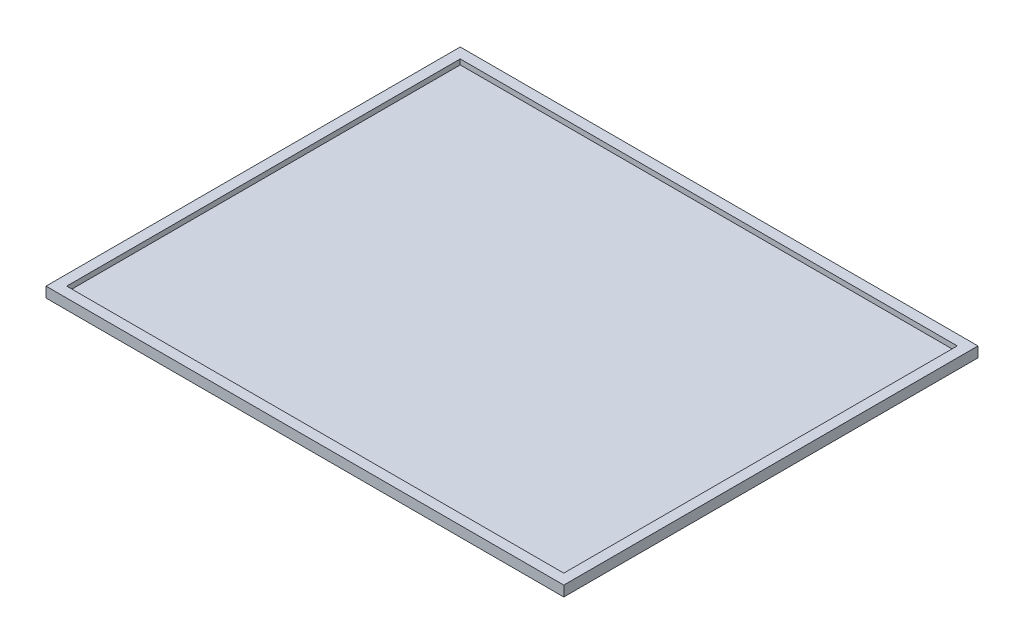
ISO-10303-21;
HEADER;
FILE_DESCRIPTION(('STEP AP214'),'2;1');
FILE_NAME('part.step','',(''),(''),'','','');
FILE_SCHEMA(('AUTOMOTIVE_DESIGN { 1 0 10303 214 1 1 1 1 }'));
ENDSEC;
DATA;
#1=APPLICATION_CONTEXT('core data for automotive mechanical design processes');
#2=APPLICATION_PROTOCOL_DEFINITION('international standard','automotive_design',2000,#1);
#3=PRODUCT_CONTEXT('',#1,'mechanical');
#4=PRODUCT('Part','Part','',(#3));
#5=PRODUCT_RELATED_PRODUCT_CATEGORY('part','',(#4));
#6=PRODUCT_DEFINITION_FORMATION('','',#4);
#7=PRODUCT_DEFINITION_CONTEXT('part definition',#1,'design');
#8=PRODUCT_DEFINITION('design','',#6,#7);
#9=PRODUCT_DEFINITION_SHAPE('','',#8);
#10=(LENGTH_UNIT() NAMED_UNIT(*) SI_UNIT(.MILLI.,.METRE.));
#11=(NAMED_UNIT(*) PLANE_ANGLE_UNIT() SI_UNIT($,.RADIAN.));
#12=(NAMED_UNIT(*) SI_UNIT($,.STERADIAN.) SOLID_ANGLE_UNIT());
#13=UNCERTAINTY_MEASURE_WITH_UNIT(LENGTH_MEASURE(1.E-05),#10,'distance_accuracy_value','');
#14=(GEOMETRIC_REPRESENTATION_CONTEXT(3) GLOBAL_UNCERTAINTY_ASSIGNED_CONTEXT((#13)) GLOBAL_UNIT_ASSIGNED_CONTEXT((#10,
#11,#12)) REPRESENTATION_CONTEXT('',''));
#15=CARTESIAN_POINT('',(0.,0.,0.));
#16=DIRECTION('',(0.,0.,1.));
#17=DIRECTION('',(1.,0.,0.));
#18=AXIS2_PLACEMENT_3D('',#15,#16,#17);
#19=CARTESIAN_POINT('',(0.,10.,0.));
#20=DIRECTION('',(0.,-1.,0.));
#21=DIRECTION('',(0.,0.,-1.));
#22=AXIS2_PLACEMENT_3D('',#19,#20,#21);
#23=PLANE('',#22);
#24=DIRECTION('',(0.,0.,-1.));
#25=VECTOR('',#24,1.);
#26=CARTESIAN_POINT('',(250.,10.,200.));
#27=LINE('',#26,#25);
#28=CARTESIAN_POINT('',(250.,10.,200.));
#29=VERTEX_POINT('',#28);
#30=CARTESIAN_POINT('',(250.,10.,-200.));
#31=VERTEX_POINT('',#30);
#32=EDGE_CURVE('E137',#29,#31,#27,.T.);
#33=ORIENTED_EDGE('',*,*,#32,.T.);
#34=DIRECTION('',(-1.,0.,0.));
#35=VECTOR('',#34,1.);
#36=CARTESIAN_POINT('',(-250.,10.,-200.));
#37=LINE('',#36,#35);
#38=CARTESIAN_POINT('',(-250.,10.,-200.));
#39=VERTEX_POINT('',#38);
#40=EDGE_CURVE('E140',#31,#39,#37,.T.);
#41=ORIENTED_EDGE('',*,*,#40,.T.);
#42=DIRECTION('',(0.,0.,1.));
#43=VECTOR('',#42,1.);
#44=CARTESIAN_POINT('',(-250.,10.,200.));
#45=LINE('',#44,#43);
#46=CARTESIAN_POINT('',(-250.,10.,200.));
#47=VERTEX_POINT('',#46);
#48=EDGE_CURVE('E143',#39,#47,#45,.T.);
#49=ORIENTED_EDGE('',*,*,#48,.T.);
#50=DIRECTION('',(1.,0.,0.));
#51=VECTOR('',#50,1.);
#52=CARTESIAN_POINT('',(-250.,10.,200.));
#53=LINE('',#52,#51);
#54=EDGE_CURVE('E145',#47,#29,#53,.T.);
#55=ORIENTED_EDGE('',*,*,#54,.T.);
#56=EDGE_LOOP('',(#33,#41,#49,#55));
#57=FACE_BOUND('',#56,.T.);
#58=DIRECTION('',(1.,0.,0.));
#59=VECTOR('',#58,1.);
#60=CARTESIAN_POINT('',(-240.,10.,190.));
#61=LINE('',#60,#59);
#62=CARTESIAN_POINT('',(-240.,10.,190.));
#63=VERTEX_POINT('',#62);
#64=CARTESIAN_POINT('',(240.,10.,190.));
#65=VERTEX_POINT('',#64);
#66=EDGE_CURVE('E124',#63,#65,#61,.T.);
#67=ORIENTED_EDGE('',*,*,#66,.F.);
#68=DIRECTION('',(0.,0.,1.));
#69=VECTOR('',#68,1.);
#70=CARTESIAN_POINT('',(-240.,10.,190.));
#71=LINE('',#70,#69);
#72=CARTESIAN_POINT('',(-240.,10.,-190.));
#73=VERTEX_POINT('',#72);
#74=EDGE_CURVE('E108',#73,#63,#71,.T.);
#75=ORIENTED_EDGE('',*,*,#74,.F.);
#76=DIRECTION('',(-1.,0.,0.));
#77=VECTOR('',#76,1.);
#78=CARTESIAN_POINT('',(-240.,10.,-190.));
#79=LINE('',#78,#77);
#80=CARTESIAN_POINT('',(240.,10.,-190.));
#81=VERTEX_POINT('',#80);
#82=EDGE_CURVE('E128',#81,#73,#79,.T.);
#83=ORIENTED_EDGE('',*,*,#82,.F.);
#84=DIRECTION('',(0.,0.,-1.));
#85=VECTOR('',#84,1.);
#86=CARTESIAN_POINT('',(240.,10.,190.));
#87=LINE('',#86,#85);
#88=EDGE_CURVE('E126',#65,#81,#87,.T.);
#89=ORIENTED_EDGE('',*,*,#88,.F.);
#90=EDGE_LOOP('',(#67,#75,#83,#89));
#91=FACE_BOUND('',#90,.T.);
#92=ADVANCED_FACE('F35',(#57,#91),#23,.F.);
#93=CARTESIAN_POINT('',(0.,0.,0.));
#94=DIRECTION('',(0.,-1.,0.));
#95=DIRECTION('',(0.,0.,-1.));
#96=AXIS2_PLACEMENT_3D('',#93,#94,#95);
#97=PLANE('',#96);
#98=DIRECTION('',(0.,0.,-1.));
#99=VECTOR('',#98,1.);
#100=CARTESIAN_POINT('',(250.,0.,200.));
#101=LINE('',#100,#99);
#102=CARTESIAN_POINT('',(250.,0.,200.));
#103=VERTEX_POINT('',#102);
#104=CARTESIAN_POINT('',(250.,0.,-200.));
#105=VERTEX_POINT('',#104);
#106=EDGE_CURVE('E136',#103,#105,#101,.T.);
#107=ORIENTED_EDGE('',*,*,#106,.F.);
#108=DIRECTION('',(1.,0.,0.));
#109=VECTOR('',#108,1.);
#110=CARTESIAN_POINT('',(-250.,0.,200.));
#111=LINE('',#110,#109);
#112=CARTESIAN_POINT('',(-250.,0.,200.));
#113=VERTEX_POINT('',#112);
#114=EDGE_CURVE('E141',#113,#103,#111,.T.);
#115=ORIENTED_EDGE('',*,*,#114,.F.);
#116=DIRECTION('',(0.,0.,1.));
#117=VECTOR('',#116,1.);
#118=CARTESIAN_POINT('',(-250.,0.,200.));
#119=LINE('',#118,#117);
#120=CARTESIAN_POINT('',(-250.,0.,-200.));
#121=VERTEX_POINT('',#120);
#122=EDGE_CURVE('E152',#121,#113,#119,.T.);
#123=ORIENTED_EDGE('',*,*,#122,.F.);
#124=DIRECTION('',(-1.,0.,0.));
#125=VECTOR('',#124,1.);
#126=CARTESIAN_POINT('',(-250.,0.,-200.));
#127=LINE('',#126,#125);
#128=EDGE_CURVE('E150',#105,#121,#127,.T.);
#129=ORIENTED_EDGE('',*,*,#128,.F.);
#130=EDGE_LOOP('',(#107,#115,#123,#129));
#131=FACE_BOUND('',#130,.T.);
#132=ADVANCED_FACE('F170',(#131),#97,.T.);
#133=CARTESIAN_POINT('',(250.,10.,200.));
#134=DIRECTION('',(-1.,0.,0.));
#135=DIRECTION('',(0.,0.,1.));
#136=AXIS2_PLACEMENT_3D('',#133,#134,#135);
#137=PLANE('',#136);
#138=ORIENTED_EDGE('',*,*,#106,.T.);
#139=DIRECTION('',(0.,-1.,0.));
#140=VECTOR('',#139,1.);
#141=CARTESIAN_POINT('',(250.,10.,-200.));
#142=LINE('',#141,#140);
#143=EDGE_CURVE('E11',#31,#105,#142,.T.);
#144=ORIENTED_EDGE('',*,*,#143,.F.);
#145=ORIENTED_EDGE('',*,*,#32,.F.);
#146=DIRECTION('',(0.,-1.,0.));
#147=VECTOR('',#146,1.);
#148=CARTESIAN_POINT('',(250.,10.,200.));
#149=LINE('',#148,#147);
#150=EDGE_CURVE('E147',#29,#103,#149,.T.);
#151=ORIENTED_EDGE('',*,*,#150,.T.);
#152=EDGE_LOOP('',(#138,#144,#145,#151));
#153=FACE_BOUND('',#152,.T.);
#154=ADVANCED_FACE('F37',(#153),#137,.F.);
#155=CARTESIAN_POINT('',(-250.,10.,-200.));
#156=DIRECTION('',(0.,0.,1.));
#157=DIRECTION('',(1.,0.,0.));
#158=AXIS2_PLACEMENT_3D('',#155,#156,#157);
#159=PLANE('',#158);
#160=ORIENTED_EDGE('',*,*,#128,.T.);
#161=DIRECTION('',(0.,-1.,0.));
#162=VECTOR('',#161,1.);
#163=CARTESIAN_POINT('',(-250.,10.,-200.));
#164=LINE('',#163,#162);
#165=EDGE_CURVE('E43',#39,#121,#164,.T.);
#166=ORIENTED_EDGE('',*,*,#165,.F.);
#167=ORIENTED_EDGE('',*,*,#40,.F.);
#168=ORIENTED_EDGE('',*,*,#143,.T.);
#169=EDGE_LOOP('',(#160,#166,#167,#168));
#170=FACE_BOUND('',#169,.T.);
#171=ADVANCED_FACE('F180',(#170),#159,.F.);
#172=CARTESIAN_POINT('',(-250.,10.,200.));
#173=DIRECTION('',(1.,0.,0.));
#174=DIRECTION('',(0.,0.,-1.));
#175=AXIS2_PLACEMENT_3D('',#172,#173,#174);
#176=PLANE('',#175);
#177=ORIENTED_EDGE('',*,*,#122,.T.);
#178=DIRECTION('',(0.,-1.,0.));
#179=VECTOR('',#178,1.);
#180=CARTESIAN_POINT('',(-250.,10.,200.));
#181=LINE('',#180,#179);
#182=EDGE_CURVE('E157',#47,#113,#181,.T.);
#183=ORIENTED_EDGE('',*,*,#182,.F.);
#184=ORIENTED_EDGE('',*,*,#48,.F.);
#185=ORIENTED_EDGE('',*,*,#165,.T.);
#186=EDGE_LOOP('',(#177,#183,#184,#185));
#187=FACE_BOUND('',#186,.T.);
#188=ADVANCED_FACE('F164',(#187),#176,.F.);
#189=CARTESIAN_POINT('',(-250.,10.,200.));
#190=DIRECTION('',(0.,0.,-1.));
#191=DIRECTION('',(-1.,0.,0.));
#192=AXIS2_PLACEMENT_3D('',#189,#190,#191);
#193=PLANE('',#192);
#194=ORIENTED_EDGE('',*,*,#114,.T.);
#195=ORIENTED_EDGE('',*,*,#150,.F.);
#196=ORIENTED_EDGE('',*,*,#54,.F.);
#197=ORIENTED_EDGE('',*,*,#182,.T.);
#198=EDGE_LOOP('',(#194,#195,#196,#197));
#199=FACE_BOUND('',#198,.T.);
#200=ADVANCED_FACE('F173',(#199),#193,.F.);
#201=CARTESIAN_POINT('',(-240.,10.,190.));
#202=DIRECTION('',(0.,0.,-1.));
#203=DIRECTION('',(-1.,0.,0.));
#204=AXIS2_PLACEMENT_3D('',#201,#202,#203);
#205=PLANE('',#204);
#206=DIRECTION('',(1.,0.,0.));
#207=VECTOR('',#206,1.);
#208=CARTESIAN_POINT('',(0.,5.,190.));
#209=LINE('',#208,#207);
#210=CARTESIAN_POINT('',(-240.,5.,190.));
#211=VERTEX_POINT('',#210);
#212=CARTESIAN_POINT('',(240.,5.,190.));
#213=VERTEX_POINT('',#212);
#214=EDGE_CURVE('E114',#211,#213,#209,.T.);
#215=ORIENTED_EDGE('',*,*,#214,.F.);
#216=DIRECTION('',(0.,-1.,0.));
#217=VECTOR('',#216,1.);
#218=CARTESIAN_POINT('',(-240.,10.,190.));
#219=LINE('',#218,#217);
#220=EDGE_CURVE('E102',#63,#211,#219,.T.);
#221=ORIENTED_EDGE('',*,*,#220,.F.);
#222=ORIENTED_EDGE('',*,*,#66,.T.);
#223=DIRECTION('',(0.,-1.,0.));
#224=VECTOR('',#223,1.);
#225=CARTESIAN_POINT('',(240.,10.,190.));
#226=LINE('',#225,#224);
#227=EDGE_CURVE('E116',#65,#213,#226,.T.);
#228=ORIENTED_EDGE('',*,*,#227,.T.);
#229=EDGE_LOOP('',(#215,#221,#222,#228));
#230=FACE_BOUND('',#229,.T.);
#231=ADVANCED_FACE('F115',(#230),#205,.T.);
#232=CARTESIAN_POINT('',(240.,10.,190.));
#233=DIRECTION('',(-1.,0.,0.));
#234=DIRECTION('',(0.,0.,1.));
#235=AXIS2_PLACEMENT_3D('',#232,#233,#234);
#236=PLANE('',#235);
#237=DIRECTION('',(0.,0.,-1.));
#238=VECTOR('',#237,1.);
#239=CARTESIAN_POINT('',(240.,5.,0.));
#240=LINE('',#239,#238);
#241=CARTESIAN_POINT('',(240.,5.,-190.));
#242=VERTEX_POINT('',#241);
#243=EDGE_CURVE('E50',#213,#242,#240,.T.);
#244=ORIENTED_EDGE('',*,*,#243,.F.);
#245=ORIENTED_EDGE('',*,*,#227,.F.);
#246=ORIENTED_EDGE('',*,*,#88,.T.);
#247=DIRECTION('',(0.,-1.,0.));
#248=VECTOR('',#247,1.);
#249=CARTESIAN_POINT('',(240.,10.,-190.));
#250=LINE('',#249,#248);
#251=EDGE_CURVE('E133',#81,#242,#250,.T.);
#252=ORIENTED_EDGE('',*,*,#251,.T.);
#253=EDGE_LOOP('',(#244,#245,#246,#252));
#254=FACE_BOUND('',#253,.T.);
#255=ADVANCED_FACE('F200',(#254),#236,.T.);
#256=CARTESIAN_POINT('',(-240.,10.,-190.));
#257=DIRECTION('',(0.,0.,1.));
#258=DIRECTION('',(1.,0.,0.));
#259=AXIS2_PLACEMENT_3D('',#256,#257,#258);
#260=PLANE('',#259);
#261=DIRECTION('',(1.,0.,0.));
#262=VECTOR('',#261,1.);
#263=CARTESIAN_POINT('',(0.,5.,-190.));
#264=LINE('',#263,#262);
#265=CARTESIAN_POINT('',(-240.,5.,-190.));
#266=VERTEX_POINT('',#265);
#267=EDGE_CURVE('E58',#266,#242,#264,.T.);
#268=ORIENTED_EDGE('',*,*,#267,.T.);
#269=ORIENTED_EDGE('',*,*,#251,.F.);
#270=ORIENTED_EDGE('',*,*,#82,.T.);
#271=DIRECTION('',(0.,-1.,0.));
#272=VECTOR('',#271,1.);
#273=CARTESIAN_POINT('',(-240.,10.,-190.));
#274=LINE('',#273,#272);
#275=EDGE_CURVE('E111',#73,#266,#274,.T.);
#276=ORIENTED_EDGE('',*,*,#275,.T.);
#277=EDGE_LOOP('',(#268,#269,#270,#276));
#278=FACE_BOUND('',#277,.T.);
#279=ADVANCED_FACE('F204',(#278),#260,.T.);
#280=CARTESIAN_POINT('',(-240.,10.,190.));
#281=DIRECTION('',(1.,0.,0.));
#282=DIRECTION('',(0.,0.,-1.));
#283=AXIS2_PLACEMENT_3D('',#280,#281,#282);
#284=PLANE('',#283);
#285=DIRECTION('',(0.,0.,-1.));
#286=VECTOR('',#285,1.);
#287=CARTESIAN_POINT('',(-240.,5.,0.));
#288=LINE('',#287,#286);
#289=EDGE_CURVE('E106',#211,#266,#288,.T.);
#290=ORIENTED_EDGE('',*,*,#289,.T.);
#291=ORIENTED_EDGE('',*,*,#275,.F.);
#292=ORIENTED_EDGE('',*,*,#74,.T.);
#293=ORIENTED_EDGE('',*,*,#220,.T.);
#294=EDGE_LOOP('',(#290,#291,#292,#293));
#295=FACE_BOUND('',#294,.T.);
#296=ADVANCED_FACE('F104',(#295),#284,.T.);
#297=CARTESIAN_POINT('',(0.,5.,0.));
#298=DIRECTION('',(0.,1.,0.));
#299=DIRECTION('',(0.,0.,1.));
#300=AXIS2_PLACEMENT_3D('',#297,#298,#299);
#301=PLANE('',#300);
#302=ORIENTED_EDGE('',*,*,#289,.F.);
#303=ORIENTED_EDGE('',*,*,#214,.T.);
#304=ORIENTED_EDGE('',*,*,#243,.T.);
#305=ORIENTED_EDGE('',*,*,#267,.F.);
#306=EDGE_LOOP('',(#302,#303,#304,#305));
#307=FACE_BOUND('',#306,.T.);
#308=ADVANCED_FACE('F119',(#307),#301,.T.);
#309=CLOSED_SHELL('',(#92,#132,#154,#171,#188,#200,#231,#255,#279,#296,#308));
#310=MANIFOLD_SOLID_BREP('B2',#309);
#311=ADVANCED_BREP_SHAPE_REPRESENTATION('',(#18,#310),#14);
#312=SHAPE_DEFINITION_REPRESENTATION(#9,#311);
ENDSEC;
END-ISO-10303-21;
